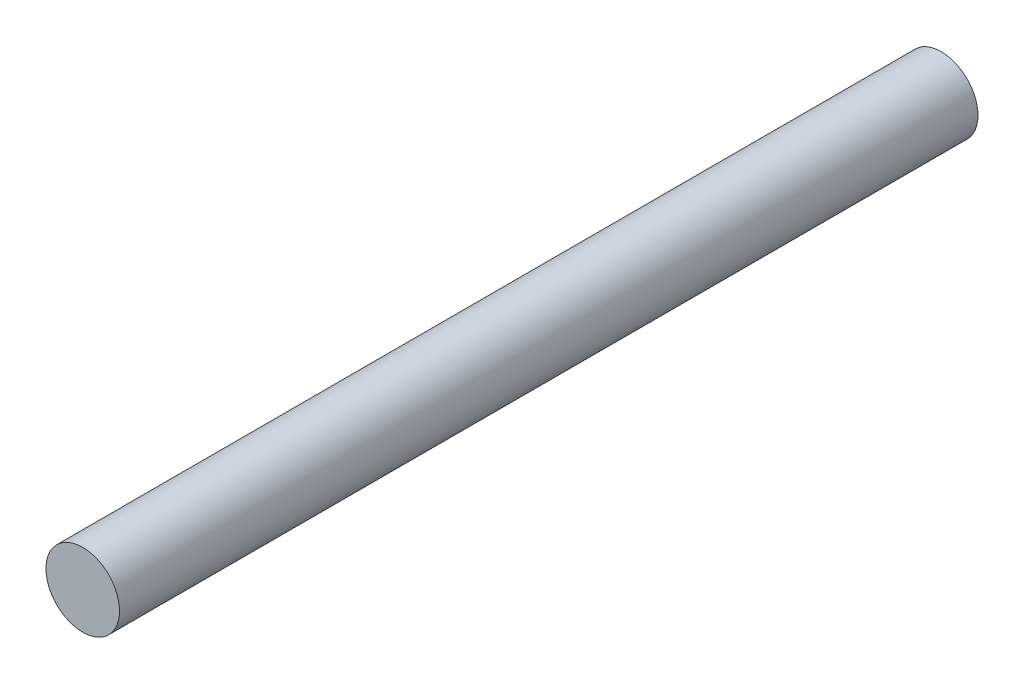
ISO-10303-21;
HEADER;
FILE_DESCRIPTION(('STEP AP214'),'2;1');
FILE_NAME('part.step','',(''),(''),'','','');
FILE_SCHEMA(('AUTOMOTIVE_DESIGN { 1 0 10303 214 1 1 1 1 }'));
ENDSEC;
DATA;
#1=APPLICATION_CONTEXT('core data for automotive mechanical design processes');
#2=APPLICATION_PROTOCOL_DEFINITION('international standard','automotive_design',2000,#1);
#3=PRODUCT_CONTEXT('',#1,'mechanical');
#4=PRODUCT('Part','Part','',(#3));
#5=PRODUCT_RELATED_PRODUCT_CATEGORY('part','',(#4));
#6=PRODUCT_DEFINITION_FORMATION('','',#4);
#7=PRODUCT_DEFINITION_CONTEXT('part definition',#1,'design');
#8=PRODUCT_DEFINITION('design','',#6,#7);
#9=PRODUCT_DEFINITION_SHAPE('','',#8);
#10=(LENGTH_UNIT() NAMED_UNIT(*) SI_UNIT(.MILLI.,.METRE.));
#11=(NAMED_UNIT(*) PLANE_ANGLE_UNIT() SI_UNIT($,.RADIAN.));
#12=(NAMED_UNIT(*) SI_UNIT($,.STERADIAN.) SOLID_ANGLE_UNIT());
#13=UNCERTAINTY_MEASURE_WITH_UNIT(LENGTH_MEASURE(1.E-05),#10,'distance_accuracy_value','');
#14=(GEOMETRIC_REPRESENTATION_CONTEXT(3) GLOBAL_UNCERTAINTY_ASSIGNED_CONTEXT((#13)) GLOBAL_UNIT_ASSIGNED_CONTEXT((#10,
#11,#12)) REPRESENTATION_CONTEXT('',''));
#15=CARTESIAN_POINT('',(0.,0.,0.));
#16=DIRECTION('',(0.,0.,1.));
#17=DIRECTION('',(1.,0.,0.));
#18=AXIS2_PLACEMENT_3D('',#15,#16,#17);
#19=CARTESIAN_POINT('',(0.,0.,70.));
#20=DIRECTION('',(0.,0.,-1.));
#21=DIRECTION('',(-1.,0.,0.));
#22=AXIS2_PLACEMENT_3D('',#19,#20,#21);
#23=CYLINDRICAL_SURFACE('',#22,3.);
#24=CARTESIAN_POINT('',(0.,0.,70.));
#25=DIRECTION('',(0.,0.,1.));
#26=DIRECTION('',(1.,0.,0.));
#27=AXIS2_PLACEMENT_3D('',#24,#25,#26);
#28=CIRCLE('',#27,3.);
#29=CARTESIAN_POINT('',(3.,0.,70.));
#30=VERTEX_POINT('',#29);
#31=EDGE_CURVE('E10',#30,#30,#28,.T.);
#32=ORIENTED_EDGE('',*,*,#31,.F.);
#33=EDGE_LOOP('',(#32));
#34=FACE_BOUND('',#33,.T.);
#35=CARTESIAN_POINT('',(0.,0.,0.));
#36=DIRECTION('',(0.,0.,1.));
#37=DIRECTION('',(1.,0.,0.));
#38=AXIS2_PLACEMENT_3D('',#35,#36,#37);
#39=CIRCLE('',#38,3.);
#40=CARTESIAN_POINT('',(3.,0.,0.));
#41=VERTEX_POINT('',#40);
#42=EDGE_CURVE('E34',#41,#41,#39,.T.);
#43=ORIENTED_EDGE('',*,*,#42,.T.);
#44=EDGE_LOOP('',(#43));
#45=FACE_BOUND('',#44,.T.);
#46=ADVANCED_FACE('F31',(#34,#45),#23,.T.);
#47=CARTESIAN_POINT('',(0.,0.,70.));
#48=DIRECTION('',(0.,0.,1.));
#49=DIRECTION('',(1.,0.,0.));
#50=AXIS2_PLACEMENT_3D('',#47,#48,#49);
#51=PLANE('',#50);
#52=ORIENTED_EDGE('',*,*,#31,.T.);
#53=EDGE_LOOP('',(#52));
#54=FACE_BOUND('',#53,.T.);
#55=ADVANCED_FACE('F46',(#54),#51,.T.);
#56=CARTESIAN_POINT('',(0.,0.,0.));
#57=DIRECTION('',(0.,0.,1.));
#58=DIRECTION('',(1.,0.,0.));
#59=AXIS2_PLACEMENT_3D('',#56,#57,#58);
#60=PLANE('',#59);
#61=ORIENTED_EDGE('',*,*,#42,.F.);
#62=EDGE_LOOP('',(#61));
#63=FACE_BOUND('',#62,.T.);
#64=ADVANCED_FACE('F44',(#63),#60,.F.);
#65=CLOSED_SHELL('',(#46,#55,#64));
#66=MANIFOLD_SOLID_BREP('B2',#65);
#67=ADVANCED_BREP_SHAPE_REPRESENTATION('',(#18,#66),#14);
#68=SHAPE_DEFINITION_REPRESENTATION(#9,#67);
ENDSEC;
END-ISO-10303-21;
